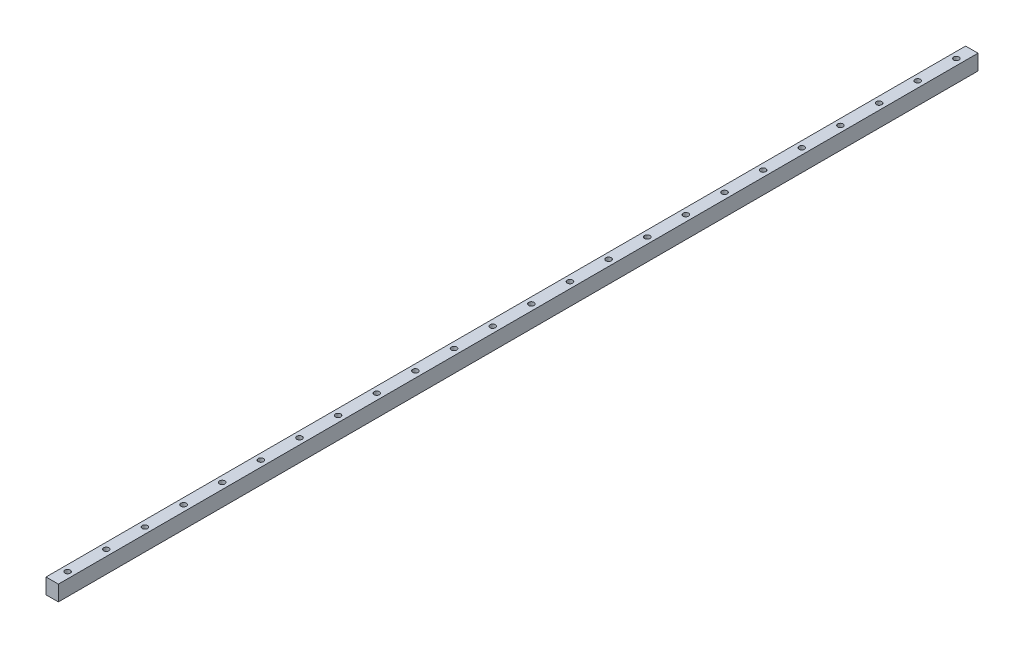
ISO-10303-21;
HEADER;
FILE_DESCRIPTION(('STEP AP214'),'2;1');
FILE_NAME('part.step','',(''),(''),'','','');
FILE_SCHEMA(('AUTOMOTIVE_DESIGN { 1 0 10303 214 1 1 1 1 }'));
ENDSEC;
DATA;
#1=APPLICATION_CONTEXT('core data for automotive mechanical design processes');
#2=APPLICATION_PROTOCOL_DEFINITION('international standard','automotive_design',2000,#1);
#3=PRODUCT_CONTEXT('',#1,'mechanical');
#4=PRODUCT('Part','Part','',(#3));
#5=PRODUCT_RELATED_PRODUCT_CATEGORY('part','',(#4));
#6=PRODUCT_DEFINITION_FORMATION('','',#4);
#7=PRODUCT_DEFINITION_CONTEXT('part definition',#1,'design');
#8=PRODUCT_DEFINITION('design','',#6,#7);
#9=PRODUCT_DEFINITION_SHAPE('','',#8);
#10=(LENGTH_UNIT() NAMED_UNIT(*) SI_UNIT(.MILLI.,.METRE.));
#11=(NAMED_UNIT(*) PLANE_ANGLE_UNIT() SI_UNIT($,.RADIAN.));
#12=(NAMED_UNIT(*) SI_UNIT($,.STERADIAN.) SOLID_ANGLE_UNIT());
#13=UNCERTAINTY_MEASURE_WITH_UNIT(LENGTH_MEASURE(1.E-05),#10,'distance_accuracy_value','');
#14=(GEOMETRIC_REPRESENTATION_CONTEXT(3) GLOBAL_UNCERTAINTY_ASSIGNED_CONTEXT((#13)) GLOBAL_UNIT_ASSIGNED_CONTEXT((#10,
#11,#12)) REPRESENTATION_CONTEXT('',''));
#15=CARTESIAN_POINT('',(0.,0.,0.));
#16=DIRECTION('',(0.,0.,1.));
#17=DIRECTION('',(1.,0.,0.));
#18=AXIS2_PLACEMENT_3D('',#15,#16,#17);
#19=CARTESIAN_POINT('',(0.,-5.,585.));
#20=DIRECTION('',(0.,1.,0.));
#21=DIRECTION('',(0.,0.,1.));
#22=AXIS2_PLACEMENT_3D('',#19,#20,#21);
#23=CYLINDRICAL_SURFACE('',#22,1.75);
#24=CARTESIAN_POINT('',(0.,-5.,585.));
#25=DIRECTION('',(0.,1.,0.));
#26=DIRECTION('',(0.,0.,1.));
#27=AXIS2_PLACEMENT_3D('',#24,#25,#26);
#28=CIRCLE('',#27,1.75);
#29=CARTESIAN_POINT('',(0.,-5.,586.75));
#30=VERTEX_POINT('',#29);
#31=EDGE_CURVE('E48',#30,#30,#28,.T.);
#32=ORIENTED_EDGE('',*,*,#31,.F.);
#33=EDGE_LOOP('',(#32));
#34=FACE_BOUND('',#33,.T.);
#35=CARTESIAN_POINT('',(0.,5.,585.));
#36=DIRECTION('',(0.,1.,0.));
#37=DIRECTION('',(0.,0.,1.));
#38=AXIS2_PLACEMENT_3D('',#35,#36,#37);
#39=CIRCLE('',#38,1.75);
#40=CARTESIAN_POINT('',(0.,5.,586.75));
#41=VERTEX_POINT('',#40);
#42=EDGE_CURVE('E11',#41,#41,#39,.T.);
#43=ORIENTED_EDGE('',*,*,#42,.T.);
#44=EDGE_LOOP('',(#43));
#45=FACE_BOUND('',#44,.T.);
#46=ADVANCED_FACE('F39',(#34,#45),#23,.F.);
#47=CARTESIAN_POINT('',(0.,-5.,560.));
#48=DIRECTION('',(0.,1.,0.));
#49=DIRECTION('',(0.,0.,1.));
#50=AXIS2_PLACEMENT_3D('',#47,#48,#49);
#51=CYLINDRICAL_SURFACE('',#50,1.75);
#52=CARTESIAN_POINT('',(0.,-5.,560.));
#53=DIRECTION('',(0.,1.,0.));
#54=DIRECTION('',(0.,0.,1.));
#55=AXIS2_PLACEMENT_3D('',#52,#53,#54);
#56=CIRCLE('',#55,1.75);
#57=CARTESIAN_POINT('',(0.,-5.,561.75));
#58=VERTEX_POINT('',#57);
#59=EDGE_CURVE('E289',#58,#58,#56,.T.);
#60=ORIENTED_EDGE('',*,*,#59,.F.);
#61=EDGE_LOOP('',(#60));
#62=FACE_BOUND('',#61,.T.);
#63=CARTESIAN_POINT('',(0.,5.,560.));
#64=DIRECTION('',(0.,1.,0.));
#65=DIRECTION('',(0.,0.,1.));
#66=AXIS2_PLACEMENT_3D('',#63,#64,#65);
#67=CIRCLE('',#66,1.75);
#68=CARTESIAN_POINT('',(0.,5.,561.75));
#69=VERTEX_POINT('',#68);
#70=EDGE_CURVE('E293',#69,#69,#67,.T.);
#71=ORIENTED_EDGE('',*,*,#70,.T.);
#72=EDGE_LOOP('',(#71));
#73=FACE_BOUND('',#72,.T.);
#74=ADVANCED_FACE('F304',(#62,#73),#51,.F.);
#75=CARTESIAN_POINT('',(0.,-5.,535.));
#76=DIRECTION('',(0.,1.,0.));
#77=DIRECTION('',(0.,0.,1.));
#78=AXIS2_PLACEMENT_3D('',#75,#76,#77);
#79=CYLINDRICAL_SURFACE('',#78,1.75);
#80=CARTESIAN_POINT('',(0.,-5.,535.));
#81=DIRECTION('',(0.,1.,0.));
#82=DIRECTION('',(0.,0.,1.));
#83=AXIS2_PLACEMENT_3D('',#80,#81,#82);
#84=CIRCLE('',#83,1.75);
#85=CARTESIAN_POINT('',(0.,-5.,536.75));
#86=VERTEX_POINT('',#85);
#87=EDGE_CURVE('E281',#86,#86,#84,.T.);
#88=ORIENTED_EDGE('',*,*,#87,.F.);
#89=EDGE_LOOP('',(#88));
#90=FACE_BOUND('',#89,.T.);
#91=CARTESIAN_POINT('',(0.,5.,535.));
#92=DIRECTION('',(0.,1.,0.));
#93=DIRECTION('',(0.,0.,1.));
#94=AXIS2_PLACEMENT_3D('',#91,#92,#93);
#95=CIRCLE('',#94,1.75);
#96=CARTESIAN_POINT('',(0.,5.,536.75));
#97=VERTEX_POINT('',#96);
#98=EDGE_CURVE('E285',#97,#97,#95,.T.);
#99=ORIENTED_EDGE('',*,*,#98,.T.);
#100=EDGE_LOOP('',(#99));
#101=FACE_BOUND('',#100,.T.);
#102=ADVANCED_FACE('F397',(#90,#101),#79,.F.);
#103=CARTESIAN_POINT('',(0.,-5.,510.));
#104=DIRECTION('',(0.,1.,0.));
#105=DIRECTION('',(0.,0.,1.));
#106=AXIS2_PLACEMENT_3D('',#103,#104,#105);
#107=CYLINDRICAL_SURFACE('',#106,1.75);
#108=CARTESIAN_POINT('',(0.,-5.,510.));
#109=DIRECTION('',(0.,1.,0.));
#110=DIRECTION('',(0.,0.,1.));
#111=AXIS2_PLACEMENT_3D('',#108,#109,#110);
#112=CIRCLE('',#111,1.75);
#113=CARTESIAN_POINT('',(0.,-5.,511.75));
#114=VERTEX_POINT('',#113);
#115=EDGE_CURVE('E273',#114,#114,#112,.T.);
#116=ORIENTED_EDGE('',*,*,#115,.F.);
#117=EDGE_LOOP('',(#116));
#118=FACE_BOUND('',#117,.T.);
#119=CARTESIAN_POINT('',(0.,5.,510.));
#120=DIRECTION('',(0.,1.,0.));
#121=DIRECTION('',(0.,0.,1.));
#122=AXIS2_PLACEMENT_3D('',#119,#120,#121);
#123=CIRCLE('',#122,1.75);
#124=CARTESIAN_POINT('',(0.,5.,511.75));
#125=VERTEX_POINT('',#124);
#126=EDGE_CURVE('E277',#125,#125,#123,.T.);
#127=ORIENTED_EDGE('',*,*,#126,.T.);
#128=EDGE_LOOP('',(#127));
#129=FACE_BOUND('',#128,.T.);
#130=ADVANCED_FACE('F393',(#118,#129),#107,.F.);
#131=CARTESIAN_POINT('',(0.,-5.,485.));
#132=DIRECTION('',(0.,1.,0.));
#133=DIRECTION('',(0.,0.,1.));
#134=AXIS2_PLACEMENT_3D('',#131,#132,#133);
#135=CYLINDRICAL_SURFACE('',#134,1.75);
#136=CARTESIAN_POINT('',(0.,-5.,485.));
#137=DIRECTION('',(0.,1.,0.));
#138=DIRECTION('',(0.,0.,1.));
#139=AXIS2_PLACEMENT_3D('',#136,#137,#138);
#140=CIRCLE('',#139,1.75);
#141=CARTESIAN_POINT('',(0.,-5.,486.75));
#142=VERTEX_POINT('',#141);
#143=EDGE_CURVE('E265',#142,#142,#140,.T.);
#144=ORIENTED_EDGE('',*,*,#143,.F.);
#145=EDGE_LOOP('',(#144));
#146=FACE_BOUND('',#145,.T.);
#147=CARTESIAN_POINT('',(0.,5.,485.));
#148=DIRECTION('',(0.,1.,0.));
#149=DIRECTION('',(0.,0.,1.));
#150=AXIS2_PLACEMENT_3D('',#147,#148,#149);
#151=CIRCLE('',#150,1.75);
#152=CARTESIAN_POINT('',(0.,5.,486.75));
#153=VERTEX_POINT('',#152);
#154=EDGE_CURVE('E269',#153,#153,#151,.T.);
#155=ORIENTED_EDGE('',*,*,#154,.T.);
#156=EDGE_LOOP('',(#155));
#157=FACE_BOUND('',#156,.T.);
#158=ADVANCED_FACE('F389',(#146,#157),#135,.F.);
#159=CARTESIAN_POINT('',(0.,-5.,460.));
#160=DIRECTION('',(0.,1.,0.));
#161=DIRECTION('',(0.,0.,1.));
#162=AXIS2_PLACEMENT_3D('',#159,#160,#161);
#163=CYLINDRICAL_SURFACE('',#162,1.75);
#164=CARTESIAN_POINT('',(0.,-5.,460.));
#165=DIRECTION('',(0.,1.,0.));
#166=DIRECTION('',(0.,0.,1.));
#167=AXIS2_PLACEMENT_3D('',#164,#165,#166);
#168=CIRCLE('',#167,1.75);
#169=CARTESIAN_POINT('',(0.,-5.,461.75));
#170=VERTEX_POINT('',#169);
#171=EDGE_CURVE('E257',#170,#170,#168,.T.);
#172=ORIENTED_EDGE('',*,*,#171,.F.);
#173=EDGE_LOOP('',(#172));
#174=FACE_BOUND('',#173,.T.);
#175=CARTESIAN_POINT('',(0.,5.,460.));
#176=DIRECTION('',(0.,1.,0.));
#177=DIRECTION('',(0.,0.,1.));
#178=AXIS2_PLACEMENT_3D('',#175,#176,#177);
#179=CIRCLE('',#178,1.75);
#180=CARTESIAN_POINT('',(0.,5.,461.75));
#181=VERTEX_POINT('',#180);
#182=EDGE_CURVE('E261',#181,#181,#179,.T.);
#183=ORIENTED_EDGE('',*,*,#182,.T.);
#184=EDGE_LOOP('',(#183));
#185=FACE_BOUND('',#184,.T.);
#186=ADVANCED_FACE('F385',(#174,#185),#163,.F.);
#187=CARTESIAN_POINT('',(0.,-5.,435.));
#188=DIRECTION('',(0.,1.,0.));
#189=DIRECTION('',(0.,0.,1.));
#190=AXIS2_PLACEMENT_3D('',#187,#188,#189);
#191=CYLINDRICAL_SURFACE('',#190,1.75);
#192=CARTESIAN_POINT('',(0.,-5.,435.));
#193=DIRECTION('',(0.,1.,0.));
#194=DIRECTION('',(0.,0.,1.));
#195=AXIS2_PLACEMENT_3D('',#192,#193,#194);
#196=CIRCLE('',#195,1.75);
#197=CARTESIAN_POINT('',(0.,-5.,436.75));
#198=VERTEX_POINT('',#197);
#199=EDGE_CURVE('E249',#198,#198,#196,.T.);
#200=ORIENTED_EDGE('',*,*,#199,.F.);
#201=EDGE_LOOP('',(#200));
#202=FACE_BOUND('',#201,.T.);
#203=CARTESIAN_POINT('',(0.,5.,435.));
#204=DIRECTION('',(0.,1.,0.));
#205=DIRECTION('',(0.,0.,1.));
#206=AXIS2_PLACEMENT_3D('',#203,#204,#205);
#207=CIRCLE('',#206,1.75);
#208=CARTESIAN_POINT('',(0.,5.,436.75));
#209=VERTEX_POINT('',#208);
#210=EDGE_CURVE('E253',#209,#209,#207,.T.);
#211=ORIENTED_EDGE('',*,*,#210,.T.);
#212=EDGE_LOOP('',(#211));
#213=FACE_BOUND('',#212,.T.);
#214=ADVANCED_FACE('F381',(#202,#213),#191,.F.);
#215=CARTESIAN_POINT('',(0.,-5.,410.));
#216=DIRECTION('',(0.,1.,0.));
#217=DIRECTION('',(0.,0.,1.));
#218=AXIS2_PLACEMENT_3D('',#215,#216,#217);
#219=CYLINDRICAL_SURFACE('',#218,1.75);
#220=CARTESIAN_POINT('',(0.,-5.,410.));
#221=DIRECTION('',(0.,1.,0.));
#222=DIRECTION('',(0.,0.,1.));
#223=AXIS2_PLACEMENT_3D('',#220,#221,#222);
#224=CIRCLE('',#223,1.75);
#225=CARTESIAN_POINT('',(0.,-5.,411.75));
#226=VERTEX_POINT('',#225);
#227=EDGE_CURVE('E241',#226,#226,#224,.T.);
#228=ORIENTED_EDGE('',*,*,#227,.F.);
#229=EDGE_LOOP('',(#228));
#230=FACE_BOUND('',#229,.T.);
#231=CARTESIAN_POINT('',(0.,5.,410.));
#232=DIRECTION('',(0.,1.,0.));
#233=DIRECTION('',(0.,0.,1.));
#234=AXIS2_PLACEMENT_3D('',#231,#232,#233);
#235=CIRCLE('',#234,1.75);
#236=CARTESIAN_POINT('',(0.,5.,411.75));
#237=VERTEX_POINT('',#236);
#238=EDGE_CURVE('E245',#237,#237,#235,.T.);
#239=ORIENTED_EDGE('',*,*,#238,.T.);
#240=EDGE_LOOP('',(#239));
#241=FACE_BOUND('',#240,.T.);
#242=ADVANCED_FACE('F377',(#230,#241),#219,.F.);
#243=CARTESIAN_POINT('',(0.,-5.,385.));
#244=DIRECTION('',(0.,1.,0.));
#245=DIRECTION('',(0.,0.,1.));
#246=AXIS2_PLACEMENT_3D('',#243,#244,#245);
#247=CYLINDRICAL_SURFACE('',#246,1.75);
#248=CARTESIAN_POINT('',(0.,-5.,385.));
#249=DIRECTION('',(0.,1.,0.));
#250=DIRECTION('',(0.,0.,1.));
#251=AXIS2_PLACEMENT_3D('',#248,#249,#250);
#252=CIRCLE('',#251,1.75);
#253=CARTESIAN_POINT('',(0.,-5.,386.75));
#254=VERTEX_POINT('',#253);
#255=EDGE_CURVE('E233',#254,#254,#252,.T.);
#256=ORIENTED_EDGE('',*,*,#255,.F.);
#257=EDGE_LOOP('',(#256));
#258=FACE_BOUND('',#257,.T.);
#259=CARTESIAN_POINT('',(0.,5.,385.));
#260=DIRECTION('',(0.,1.,0.));
#261=DIRECTION('',(0.,0.,1.));
#262=AXIS2_PLACEMENT_3D('',#259,#260,#261);
#263=CIRCLE('',#262,1.75);
#264=CARTESIAN_POINT('',(0.,5.,386.75));
#265=VERTEX_POINT('',#264);
#266=EDGE_CURVE('E237',#265,#265,#263,.T.);
#267=ORIENTED_EDGE('',*,*,#266,.T.);
#268=EDGE_LOOP('',(#267));
#269=FACE_BOUND('',#268,.T.);
#270=ADVANCED_FACE('F373',(#258,#269),#247,.F.);
#271=CARTESIAN_POINT('',(0.,-5.,360.));
#272=DIRECTION('',(0.,1.,0.));
#273=DIRECTION('',(0.,0.,1.));
#274=AXIS2_PLACEMENT_3D('',#271,#272,#273);
#275=CYLINDRICAL_SURFACE('',#274,1.75);
#276=CARTESIAN_POINT('',(0.,-5.,360.));
#277=DIRECTION('',(0.,1.,0.));
#278=DIRECTION('',(0.,0.,1.));
#279=AXIS2_PLACEMENT_3D('',#276,#277,#278);
#280=CIRCLE('',#279,1.75);
#281=CARTESIAN_POINT('',(0.,-5.,361.75));
#282=VERTEX_POINT('',#281);
#283=EDGE_CURVE('E225',#282,#282,#280,.T.);
#284=ORIENTED_EDGE('',*,*,#283,.F.);
#285=EDGE_LOOP('',(#284));
#286=FACE_BOUND('',#285,.T.);
#287=CARTESIAN_POINT('',(0.,5.,360.));
#288=DIRECTION('',(0.,1.,0.));
#289=DIRECTION('',(0.,0.,1.));
#290=AXIS2_PLACEMENT_3D('',#287,#288,#289);
#291=CIRCLE('',#290,1.75);
#292=CARTESIAN_POINT('',(0.,5.,361.75));
#293=VERTEX_POINT('',#292);
#294=EDGE_CURVE('E229',#293,#293,#291,.T.);
#295=ORIENTED_EDGE('',*,*,#294,.T.);
#296=EDGE_LOOP('',(#295));
#297=FACE_BOUND('',#296,.T.);
#298=ADVANCED_FACE('F369',(#286,#297),#275,.F.);
#299=CARTESIAN_POINT('',(0.,-5.,335.));
#300=DIRECTION('',(0.,1.,0.));
#301=DIRECTION('',(0.,0.,1.));
#302=AXIS2_PLACEMENT_3D('',#299,#300,#301);
#303=CYLINDRICAL_SURFACE('',#302,1.75);
#304=CARTESIAN_POINT('',(0.,-5.,335.));
#305=DIRECTION('',(0.,1.,0.));
#306=DIRECTION('',(0.,0.,1.));
#307=AXIS2_PLACEMENT_3D('',#304,#305,#306);
#308=CIRCLE('',#307,1.75);
#309=CARTESIAN_POINT('',(0.,-5.,336.75));
#310=VERTEX_POINT('',#309);
#311=EDGE_CURVE('E217',#310,#310,#308,.T.);
#312=ORIENTED_EDGE('',*,*,#311,.F.);
#313=EDGE_LOOP('',(#312));
#314=FACE_BOUND('',#313,.T.);
#315=CARTESIAN_POINT('',(0.,5.,335.));
#316=DIRECTION('',(0.,1.,0.));
#317=DIRECTION('',(0.,0.,1.));
#318=AXIS2_PLACEMENT_3D('',#315,#316,#317);
#319=CIRCLE('',#318,1.75);
#320=CARTESIAN_POINT('',(0.,5.,336.75));
#321=VERTEX_POINT('',#320);
#322=EDGE_CURVE('E221',#321,#321,#319,.T.);
#323=ORIENTED_EDGE('',*,*,#322,.T.);
#324=EDGE_LOOP('',(#323));
#325=FACE_BOUND('',#324,.T.);
#326=ADVANCED_FACE('F365',(#314,#325),#303,.F.);
#327=CARTESIAN_POINT('',(0.,-5.,310.));
#328=DIRECTION('',(0.,1.,0.));
#329=DIRECTION('',(0.,0.,1.));
#330=AXIS2_PLACEMENT_3D('',#327,#328,#329);
#331=CYLINDRICAL_SURFACE('',#330,1.75);
#332=CARTESIAN_POINT('',(0.,-5.,310.));
#333=DIRECTION('',(0.,1.,0.));
#334=DIRECTION('',(0.,0.,1.));
#335=AXIS2_PLACEMENT_3D('',#332,#333,#334);
#336=CIRCLE('',#335,1.75);
#337=CARTESIAN_POINT('',(0.,-5.,311.75));
#338=VERTEX_POINT('',#337);
#339=EDGE_CURVE('E209',#338,#338,#336,.T.);
#340=ORIENTED_EDGE('',*,*,#339,.F.);
#341=EDGE_LOOP('',(#340));
#342=FACE_BOUND('',#341,.T.);
#343=CARTESIAN_POINT('',(0.,5.,310.));
#344=DIRECTION('',(0.,1.,0.));
#345=DIRECTION('',(0.,0.,1.));
#346=AXIS2_PLACEMENT_3D('',#343,#344,#345);
#347=CIRCLE('',#346,1.75);
#348=CARTESIAN_POINT('',(0.,5.,311.75));
#349=VERTEX_POINT('',#348);
#350=EDGE_CURVE('E213',#349,#349,#347,.T.);
#351=ORIENTED_EDGE('',*,*,#350,.T.);
#352=EDGE_LOOP('',(#351));
#353=FACE_BOUND('',#352,.T.);
#354=ADVANCED_FACE('F361',(#342,#353),#331,.F.);
#355=CARTESIAN_POINT('',(0.,-5.,285.));
#356=DIRECTION('',(0.,1.,0.));
#357=DIRECTION('',(0.,0.,1.));
#358=AXIS2_PLACEMENT_3D('',#355,#356,#357);
#359=CYLINDRICAL_SURFACE('',#358,1.75);
#360=CARTESIAN_POINT('',(0.,-5.,285.));
#361=DIRECTION('',(0.,1.,0.));
#362=DIRECTION('',(0.,0.,1.));
#363=AXIS2_PLACEMENT_3D('',#360,#361,#362);
#364=CIRCLE('',#363,1.75);
#365=CARTESIAN_POINT('',(0.,-5.,286.75));
#366=VERTEX_POINT('',#365);
#367=EDGE_CURVE('E201',#366,#366,#364,.T.);
#368=ORIENTED_EDGE('',*,*,#367,.F.);
#369=EDGE_LOOP('',(#368));
#370=FACE_BOUND('',#369,.T.);
#371=CARTESIAN_POINT('',(0.,5.,285.));
#372=DIRECTION('',(0.,1.,0.));
#373=DIRECTION('',(0.,0.,1.));
#374=AXIS2_PLACEMENT_3D('',#371,#372,#373);
#375=CIRCLE('',#374,1.75);
#376=CARTESIAN_POINT('',(0.,5.,286.75));
#377=VERTEX_POINT('',#376);
#378=EDGE_CURVE('E205',#377,#377,#375,.T.);
#379=ORIENTED_EDGE('',*,*,#378,.T.);
#380=EDGE_LOOP('',(#379));
#381=FACE_BOUND('',#380,.T.);
#382=ADVANCED_FACE('F357',(#370,#381),#359,.F.);
#383=CARTESIAN_POINT('',(0.,-5.,260.));
#384=DIRECTION('',(0.,1.,0.));
#385=DIRECTION('',(0.,0.,1.));
#386=AXIS2_PLACEMENT_3D('',#383,#384,#385);
#387=CYLINDRICAL_SURFACE('',#386,1.75);
#388=CARTESIAN_POINT('',(0.,-5.,260.));
#389=DIRECTION('',(0.,1.,0.));
#390=DIRECTION('',(0.,0.,1.));
#391=AXIS2_PLACEMENT_3D('',#388,#389,#390);
#392=CIRCLE('',#391,1.75);
#393=CARTESIAN_POINT('',(0.,-5.,261.75));
#394=VERTEX_POINT('',#393);
#395=EDGE_CURVE('E193',#394,#394,#392,.T.);
#396=ORIENTED_EDGE('',*,*,#395,.F.);
#397=EDGE_LOOP('',(#396));
#398=FACE_BOUND('',#397,.T.);
#399=CARTESIAN_POINT('',(0.,5.,260.));
#400=DIRECTION('',(0.,1.,0.));
#401=DIRECTION('',(0.,0.,1.));
#402=AXIS2_PLACEMENT_3D('',#399,#400,#401);
#403=CIRCLE('',#402,1.75);
#404=CARTESIAN_POINT('',(0.,5.,261.75));
#405=VERTEX_POINT('',#404);
#406=EDGE_CURVE('E197',#405,#405,#403,.T.);
#407=ORIENTED_EDGE('',*,*,#406,.T.);
#408=EDGE_LOOP('',(#407));
#409=FACE_BOUND('',#408,.T.);
#410=ADVANCED_FACE('F353',(#398,#409),#387,.F.);
#411=CARTESIAN_POINT('',(0.,-5.,235.));
#412=DIRECTION('',(0.,1.,0.));
#413=DIRECTION('',(0.,0.,1.));
#414=AXIS2_PLACEMENT_3D('',#411,#412,#413);
#415=CYLINDRICAL_SURFACE('',#414,1.75);
#416=CARTESIAN_POINT('',(0.,-5.,235.));
#417=DIRECTION('',(0.,1.,0.));
#418=DIRECTION('',(0.,0.,1.));
#419=AXIS2_PLACEMENT_3D('',#416,#417,#418);
#420=CIRCLE('',#419,1.75);
#421=CARTESIAN_POINT('',(0.,-5.,236.75));
#422=VERTEX_POINT('',#421);
#423=EDGE_CURVE('E185',#422,#422,#420,.T.);
#424=ORIENTED_EDGE('',*,*,#423,.F.);
#425=EDGE_LOOP('',(#424));
#426=FACE_BOUND('',#425,.T.);
#427=CARTESIAN_POINT('',(0.,5.,235.));
#428=DIRECTION('',(0.,1.,0.));
#429=DIRECTION('',(0.,0.,1.));
#430=AXIS2_PLACEMENT_3D('',#427,#428,#429);
#431=CIRCLE('',#430,1.75);
#432=CARTESIAN_POINT('',(0.,5.,236.75));
#433=VERTEX_POINT('',#432);
#434=EDGE_CURVE('E189',#433,#433,#431,.T.);
#435=ORIENTED_EDGE('',*,*,#434,.T.);
#436=EDGE_LOOP('',(#435));
#437=FACE_BOUND('',#436,.T.);
#438=ADVANCED_FACE('F349',(#426,#437),#415,.F.);
#439=CARTESIAN_POINT('',(0.,-5.,210.));
#440=DIRECTION('',(0.,1.,0.));
#441=DIRECTION('',(0.,0.,1.));
#442=AXIS2_PLACEMENT_3D('',#439,#440,#441);
#443=CYLINDRICAL_SURFACE('',#442,1.75);
#444=CARTESIAN_POINT('',(0.,-5.,210.));
#445=DIRECTION('',(0.,1.,0.));
#446=DIRECTION('',(0.,0.,1.));
#447=AXIS2_PLACEMENT_3D('',#444,#445,#446);
#448=CIRCLE('',#447,1.75);
#449=CARTESIAN_POINT('',(0.,-5.,211.75));
#450=VERTEX_POINT('',#449);
#451=EDGE_CURVE('E177',#450,#450,#448,.T.);
#452=ORIENTED_EDGE('',*,*,#451,.F.);
#453=EDGE_LOOP('',(#452));
#454=FACE_BOUND('',#453,.T.);
#455=CARTESIAN_POINT('',(0.,5.,210.));
#456=DIRECTION('',(0.,1.,0.));
#457=DIRECTION('',(0.,0.,1.));
#458=AXIS2_PLACEMENT_3D('',#455,#456,#457);
#459=CIRCLE('',#458,1.75);
#460=CARTESIAN_POINT('',(0.,5.,211.75));
#461=VERTEX_POINT('',#460);
#462=EDGE_CURVE('E181',#461,#461,#459,.T.);
#463=ORIENTED_EDGE('',*,*,#462,.T.);
#464=EDGE_LOOP('',(#463));
#465=FACE_BOUND('',#464,.T.);
#466=ADVANCED_FACE('F345',(#454,#465),#443,.F.);
#467=CARTESIAN_POINT('',(0.,-5.,185.));
#468=DIRECTION('',(0.,1.,0.));
#469=DIRECTION('',(0.,0.,1.));
#470=AXIS2_PLACEMENT_3D('',#467,#468,#469);
#471=CYLINDRICAL_SURFACE('',#470,1.75);
#472=CARTESIAN_POINT('',(0.,-5.,185.));
#473=DIRECTION('',(0.,1.,0.));
#474=DIRECTION('',(0.,0.,1.));
#475=AXIS2_PLACEMENT_3D('',#472,#473,#474);
#476=CIRCLE('',#475,1.75);
#477=CARTESIAN_POINT('',(0.,-5.,186.75));
#478=VERTEX_POINT('',#477);
#479=EDGE_CURVE('E169',#478,#478,#476,.T.);
#480=ORIENTED_EDGE('',*,*,#479,.F.);
#481=EDGE_LOOP('',(#480));
#482=FACE_BOUND('',#481,.T.);
#483=CARTESIAN_POINT('',(0.,5.,185.));
#484=DIRECTION('',(0.,1.,0.));
#485=DIRECTION('',(0.,0.,1.));
#486=AXIS2_PLACEMENT_3D('',#483,#484,#485);
#487=CIRCLE('',#486,1.75);
#488=CARTESIAN_POINT('',(0.,5.,186.75));
#489=VERTEX_POINT('',#488);
#490=EDGE_CURVE('E173',#489,#489,#487,.T.);
#491=ORIENTED_EDGE('',*,*,#490,.T.);
#492=EDGE_LOOP('',(#491));
#493=FACE_BOUND('',#492,.T.);
#494=ADVANCED_FACE('F341',(#482,#493),#471,.F.);
#495=CARTESIAN_POINT('',(0.,-5.,160.));
#496=DIRECTION('',(0.,1.,0.));
#497=DIRECTION('',(0.,0.,1.));
#498=AXIS2_PLACEMENT_3D('',#495,#496,#497);
#499=CYLINDRICAL_SURFACE('',#498,1.75);
#500=CARTESIAN_POINT('',(0.,-5.,160.));
#501=DIRECTION('',(0.,1.,0.));
#502=DIRECTION('',(0.,0.,1.));
#503=AXIS2_PLACEMENT_3D('',#500,#501,#502);
#504=CIRCLE('',#503,1.75);
#505=CARTESIAN_POINT('',(0.,-5.,161.75));
#506=VERTEX_POINT('',#505);
#507=EDGE_CURVE('E161',#506,#506,#504,.T.);
#508=ORIENTED_EDGE('',*,*,#507,.F.);
#509=EDGE_LOOP('',(#508));
#510=FACE_BOUND('',#509,.T.);
#511=CARTESIAN_POINT('',(0.,5.,160.));
#512=DIRECTION('',(0.,1.,0.));
#513=DIRECTION('',(0.,0.,1.));
#514=AXIS2_PLACEMENT_3D('',#511,#512,#513);
#515=CIRCLE('',#514,1.75);
#516=CARTESIAN_POINT('',(0.,5.,161.75));
#517=VERTEX_POINT('',#516);
#518=EDGE_CURVE('E165',#517,#517,#515,.T.);
#519=ORIENTED_EDGE('',*,*,#518,.T.);
#520=EDGE_LOOP('',(#519));
#521=FACE_BOUND('',#520,.T.);
#522=ADVANCED_FACE('F337',(#510,#521),#499,.F.);
#523=CARTESIAN_POINT('',(0.,-5.,135.));
#524=DIRECTION('',(0.,1.,0.));
#525=DIRECTION('',(0.,0.,1.));
#526=AXIS2_PLACEMENT_3D('',#523,#524,#525);
#527=CYLINDRICAL_SURFACE('',#526,1.75);
#528=CARTESIAN_POINT('',(0.,-5.,135.));
#529=DIRECTION('',(0.,1.,0.));
#530=DIRECTION('',(0.,0.,1.));
#531=AXIS2_PLACEMENT_3D('',#528,#529,#530);
#532=CIRCLE('',#531,1.75);
#533=CARTESIAN_POINT('',(0.,-5.,136.75));
#534=VERTEX_POINT('',#533);
#535=EDGE_CURVE('E153',#534,#534,#532,.T.);
#536=ORIENTED_EDGE('',*,*,#535,.F.);
#537=EDGE_LOOP('',(#536));
#538=FACE_BOUND('',#537,.T.);
#539=CARTESIAN_POINT('',(0.,5.,135.));
#540=DIRECTION('',(0.,1.,0.));
#541=DIRECTION('',(0.,0.,1.));
#542=AXIS2_PLACEMENT_3D('',#539,#540,#541);
#543=CIRCLE('',#542,1.75);
#544=CARTESIAN_POINT('',(0.,5.,136.75));
#545=VERTEX_POINT('',#544);
#546=EDGE_CURVE('E157',#545,#545,#543,.T.);
#547=ORIENTED_EDGE('',*,*,#546,.T.);
#548=EDGE_LOOP('',(#547));
#549=FACE_BOUND('',#548,.T.);
#550=ADVANCED_FACE('F333',(#538,#549),#527,.F.);
#551=CARTESIAN_POINT('',(0.,-5.,110.));
#552=DIRECTION('',(0.,1.,0.));
#553=DIRECTION('',(0.,0.,1.));
#554=AXIS2_PLACEMENT_3D('',#551,#552,#553);
#555=CYLINDRICAL_SURFACE('',#554,1.75);
#556=CARTESIAN_POINT('',(0.,-5.,110.));
#557=DIRECTION('',(0.,1.,0.));
#558=DIRECTION('',(0.,0.,1.));
#559=AXIS2_PLACEMENT_3D('',#556,#557,#558);
#560=CIRCLE('',#559,1.75);
#561=CARTESIAN_POINT('',(0.,-5.,111.75));
#562=VERTEX_POINT('',#561);
#563=EDGE_CURVE('E145',#562,#562,#560,.T.);
#564=ORIENTED_EDGE('',*,*,#563,.F.);
#565=EDGE_LOOP('',(#564));
#566=FACE_BOUND('',#565,.T.);
#567=CARTESIAN_POINT('',(0.,5.,110.));
#568=DIRECTION('',(0.,1.,0.));
#569=DIRECTION('',(0.,0.,1.));
#570=AXIS2_PLACEMENT_3D('',#567,#568,#569);
#571=CIRCLE('',#570,1.75);
#572=CARTESIAN_POINT('',(0.,5.,111.75));
#573=VERTEX_POINT('',#572);
#574=EDGE_CURVE('E149',#573,#573,#571,.T.);
#575=ORIENTED_EDGE('',*,*,#574,.T.);
#576=EDGE_LOOP('',(#575));
#577=FACE_BOUND('',#576,.T.);
#578=ADVANCED_FACE('F329',(#566,#577),#555,.F.);
#579=CARTESIAN_POINT('',(0.,-5.,85.));
#580=DIRECTION('',(0.,1.,0.));
#581=DIRECTION('',(0.,0.,1.));
#582=AXIS2_PLACEMENT_3D('',#579,#580,#581);
#583=CYLINDRICAL_SURFACE('',#582,1.75);
#584=CARTESIAN_POINT('',(0.,-5.,85.));
#585=DIRECTION('',(0.,1.,0.));
#586=DIRECTION('',(0.,0.,1.));
#587=AXIS2_PLACEMENT_3D('',#584,#585,#586);
#588=CIRCLE('',#587,1.75);
#589=CARTESIAN_POINT('',(0.,-5.,86.75));
#590=VERTEX_POINT('',#589);
#591=EDGE_CURVE('E137',#590,#590,#588,.T.);
#592=ORIENTED_EDGE('',*,*,#591,.F.);
#593=EDGE_LOOP('',(#592));
#594=FACE_BOUND('',#593,.T.);
#595=CARTESIAN_POINT('',(0.,5.,85.));
#596=DIRECTION('',(0.,1.,0.));
#597=DIRECTION('',(0.,0.,1.));
#598=AXIS2_PLACEMENT_3D('',#595,#596,#597);
#599=CIRCLE('',#598,1.75);
#600=CARTESIAN_POINT('',(0.,5.,86.75));
#601=VERTEX_POINT('',#600);
#602=EDGE_CURVE('E141',#601,#601,#599,.T.);
#603=ORIENTED_EDGE('',*,*,#602,.T.);
#604=EDGE_LOOP('',(#603));
#605=FACE_BOUND('',#604,.T.);
#606=ADVANCED_FACE('F325',(#594,#605),#583,.F.);
#607=CARTESIAN_POINT('',(0.,-5.,60.));
#608=DIRECTION('',(0.,1.,0.));
#609=DIRECTION('',(0.,0.,1.));
#610=AXIS2_PLACEMENT_3D('',#607,#608,#609);
#611=CYLINDRICAL_SURFACE('',#610,1.75);
#612=CARTESIAN_POINT('',(0.,-5.,60.));
#613=DIRECTION('',(0.,1.,0.));
#614=DIRECTION('',(0.,0.,1.));
#615=AXIS2_PLACEMENT_3D('',#612,#613,#614);
#616=CIRCLE('',#615,1.75);
#617=CARTESIAN_POINT('',(0.,-5.,61.75));
#618=VERTEX_POINT('',#617);
#619=EDGE_CURVE('E129',#618,#618,#616,.T.);
#620=ORIENTED_EDGE('',*,*,#619,.F.);
#621=EDGE_LOOP('',(#620));
#622=FACE_BOUND('',#621,.T.);
#623=CARTESIAN_POINT('',(0.,5.,60.));
#624=DIRECTION('',(0.,1.,0.));
#625=DIRECTION('',(0.,0.,1.));
#626=AXIS2_PLACEMENT_3D('',#623,#624,#625);
#627=CIRCLE('',#626,1.75);
#628=CARTESIAN_POINT('',(0.,5.,61.75));
#629=VERTEX_POINT('',#628);
#630=EDGE_CURVE('E133',#629,#629,#627,.T.);
#631=ORIENTED_EDGE('',*,*,#630,.T.);
#632=EDGE_LOOP('',(#631));
#633=FACE_BOUND('',#632,.T.);
#634=ADVANCED_FACE('F316',(#622,#633),#611,.F.);
#635=CARTESIAN_POINT('',(4.,-5.,595.));
#636=DIRECTION('',(-1.,0.,0.));
#637=DIRECTION('',(0.,0.,1.));
#638=AXIS2_PLACEMENT_3D('',#635,#636,#637);
#639=PLANE('',#638);
#640=DIRECTION('',(0.,1.,0.));
#641=VECTOR('',#640,1.);
#642=CARTESIAN_POINT('',(4.,-5.,0.));
#643=LINE('',#642,#641);
#644=CARTESIAN_POINT('',(4.,-5.,0.));
#645=VERTEX_POINT('',#644);
#646=CARTESIAN_POINT('',(4.,5.,0.));
#647=VERTEX_POINT('',#646);
#648=EDGE_CURVE('E112',#645,#647,#643,.T.);
#649=ORIENTED_EDGE('',*,*,#648,.T.);
#650=DIRECTION('',(0.,0.,-1.));
#651=VECTOR('',#650,1.);
#652=CARTESIAN_POINT('',(4.,5.,595.));
#653=LINE('',#652,#651);
#654=CARTESIAN_POINT('',(4.,5.,595.));
#655=VERTEX_POINT('',#654);
#656=EDGE_CURVE('E101',#655,#647,#653,.T.);
#657=ORIENTED_EDGE('',*,*,#656,.F.);
#658=DIRECTION('',(0.,1.,0.));
#659=VECTOR('',#658,1.);
#660=CARTESIAN_POINT('',(4.,-5.,595.));
#661=LINE('',#660,#659);
#662=CARTESIAN_POINT('',(4.,-5.,595.));
#663=VERTEX_POINT('',#662);
#664=EDGE_CURVE('E92',#663,#655,#661,.T.);
#665=ORIENTED_EDGE('',*,*,#664,.F.);
#666=DIRECTION('',(0.,0.,-1.));
#667=VECTOR('',#666,1.);
#668=CARTESIAN_POINT('',(4.,-5.,595.));
#669=LINE('',#668,#667);
#670=EDGE_CURVE('E108',#663,#645,#669,.T.);
#671=ORIENTED_EDGE('',*,*,#670,.T.);
#672=EDGE_LOOP('',(#649,#657,#665,#671));
#673=FACE_BOUND('',#672,.T.);
#674=ADVANCED_FACE('F308',(#673),#639,.F.);
#675=CARTESIAN_POINT('',(-4.,5.,595.));
#676=DIRECTION('',(0.,-1.,0.));
#677=DIRECTION('',(0.,0.,-1.));
#678=AXIS2_PLACEMENT_3D('',#675,#676,#677);
#679=PLANE('',#678);
#680=CARTESIAN_POINT('',(0.,5.,35.));
#681=DIRECTION('',(0.,1.,0.));
#682=DIRECTION('',(0.,0.,1.));
#683=AXIS2_PLACEMENT_3D('',#680,#681,#682);
#684=CIRCLE('',#683,1.75);
#685=CARTESIAN_POINT('',(0.,5.,36.75));
#686=VERTEX_POINT('',#685);
#687=EDGE_CURVE('E436',#686,#686,#684,.T.);
#688=ORIENTED_EDGE('',*,*,#687,.F.);
#689=EDGE_LOOP('',(#688));
#690=FACE_BOUND('',#689,.T.);
#691=CARTESIAN_POINT('',(0.,5.,10.));
#692=DIRECTION('',(0.,1.,0.));
#693=DIRECTION('',(0.,0.,1.));
#694=AXIS2_PLACEMENT_3D('',#691,#692,#693);
#695=CIRCLE('',#694,1.75);
#696=CARTESIAN_POINT('',(0.,5.,11.75));
#697=VERTEX_POINT('',#696);
#698=EDGE_CURVE('E438',#697,#697,#695,.T.);
#699=ORIENTED_EDGE('',*,*,#698,.F.);
#700=EDGE_LOOP('',(#699));
#701=FACE_BOUND('',#700,.T.);
#702=DIRECTION('',(-1.,0.,0.));
#703=VECTOR('',#702,1.);
#704=CARTESIAN_POINT('',(-4.,5.,0.));
#705=LINE('',#704,#703);
#706=CARTESIAN_POINT('',(-4.,5.,0.));
#707=VERTEX_POINT('',#706);
#708=EDGE_CURVE('E99',#647,#707,#705,.T.);
#709=ORIENTED_EDGE('',*,*,#708,.T.);
#710=DIRECTION('',(0.,0.,-1.));
#711=VECTOR('',#710,1.);
#712=CARTESIAN_POINT('',(-4.,5.,595.));
#713=LINE('',#712,#711);
#714=CARTESIAN_POINT('',(-4.,5.,595.));
#715=VERTEX_POINT('',#714);
#716=EDGE_CURVE('E96',#715,#707,#713,.T.);
#717=ORIENTED_EDGE('',*,*,#716,.F.);
#718=DIRECTION('',(-1.,0.,0.));
#719=VECTOR('',#718,1.);
#720=CARTESIAN_POINT('',(-4.,5.,595.));
#721=LINE('',#720,#719);
#722=EDGE_CURVE('E87',#655,#715,#721,.T.);
#723=ORIENTED_EDGE('',*,*,#722,.F.);
#724=ORIENTED_EDGE('',*,*,#656,.T.);
#725=EDGE_LOOP('',(#709,#717,#723,#724));
#726=FACE_BOUND('',#725,.T.);
#727=ORIENTED_EDGE('',*,*,#630,.F.);
#728=EDGE_LOOP('',(#727));
#729=FACE_BOUND('',#728,.T.);
#730=ORIENTED_EDGE('',*,*,#602,.F.);
#731=EDGE_LOOP('',(#730));
#732=FACE_BOUND('',#731,.T.);
#733=ORIENTED_EDGE('',*,*,#574,.F.);
#734=EDGE_LOOP('',(#733));
#735=FACE_BOUND('',#734,.T.);
#736=ORIENTED_EDGE('',*,*,#546,.F.);
#737=EDGE_LOOP('',(#736));
#738=FACE_BOUND('',#737,.T.);
#739=ORIENTED_EDGE('',*,*,#518,.F.);
#740=EDGE_LOOP('',(#739));
#741=FACE_BOUND('',#740,.T.);
#742=ORIENTED_EDGE('',*,*,#490,.F.);
#743=EDGE_LOOP('',(#742));
#744=FACE_BOUND('',#743,.T.);
#745=ORIENTED_EDGE('',*,*,#462,.F.);
#746=EDGE_LOOP('',(#745));
#747=FACE_BOUND('',#746,.T.);
#748=ORIENTED_EDGE('',*,*,#434,.F.);
#749=EDGE_LOOP('',(#748));
#750=FACE_BOUND('',#749,.T.);
#751=ORIENTED_EDGE('',*,*,#406,.F.);
#752=EDGE_LOOP('',(#751));
#753=FACE_BOUND('',#752,.T.);
#754=ORIENTED_EDGE('',*,*,#378,.F.);
#755=EDGE_LOOP('',(#754));
#756=FACE_BOUND('',#755,.T.);
#757=ORIENTED_EDGE('',*,*,#350,.F.);
#758=EDGE_LOOP('',(#757));
#759=FACE_BOUND('',#758,.T.);
#760=ORIENTED_EDGE('',*,*,#322,.F.);
#761=EDGE_LOOP('',(#760));
#762=FACE_BOUND('',#761,.T.);
#763=ORIENTED_EDGE('',*,*,#294,.F.);
#764=EDGE_LOOP('',(#763));
#765=FACE_BOUND('',#764,.T.);
#766=ORIENTED_EDGE('',*,*,#266,.F.);
#767=EDGE_LOOP('',(#766));
#768=FACE_BOUND('',#767,.T.);
#769=ORIENTED_EDGE('',*,*,#238,.F.);
#770=EDGE_LOOP('',(#769));
#771=FACE_BOUND('',#770,.T.);
#772=ORIENTED_EDGE('',*,*,#210,.F.);
#773=EDGE_LOOP('',(#772));
#774=FACE_BOUND('',#773,.T.);
#775=ORIENTED_EDGE('',*,*,#182,.F.);
#776=EDGE_LOOP('',(#775));
#777=FACE_BOUND('',#776,.T.);
#778=ORIENTED_EDGE('',*,*,#154,.F.);
#779=EDGE_LOOP('',(#778));
#780=FACE_BOUND('',#779,.T.);
#781=ORIENTED_EDGE('',*,*,#126,.F.);
#782=EDGE_LOOP('',(#781));
#783=FACE_BOUND('',#782,.T.);
#784=ORIENTED_EDGE('',*,*,#98,.F.);
#785=EDGE_LOOP('',(#784));
#786=FACE_BOUND('',#785,.T.);
#787=ORIENTED_EDGE('',*,*,#70,.F.);
#788=EDGE_LOOP('',(#787));
#789=FACE_BOUND('',#788,.T.);
#790=ORIENTED_EDGE('',*,*,#42,.F.);
#791=EDGE_LOOP('',(#790));
#792=FACE_BOUND('',#791,.T.);
#793=ADVANCED_FACE('F97',(#690,#701,#726,#729,#732,#735,#738,#741,#744,#747,#750,#753,#756,#759,
#762,#765,#768,#771,#774,#777,#780,#783,#786,#789,#792),#679,.F.);
#794=CARTESIAN_POINT('',(-4.,-5.,595.));
#795=DIRECTION('',(1.,0.,0.));
#796=DIRECTION('',(0.,0.,-1.));
#797=AXIS2_PLACEMENT_3D('',#794,#795,#796);
#798=PLANE('',#797);
#799=DIRECTION('',(0.,-1.,0.));
#800=VECTOR('',#799,1.);
#801=CARTESIAN_POINT('',(-4.,-5.,0.));
#802=LINE('',#801,#800);
#803=CARTESIAN_POINT('',(-4.,-5.,0.));
#804=VERTEX_POINT('',#803);
#805=EDGE_CURVE('E73',#707,#804,#802,.T.);
#806=ORIENTED_EDGE('',*,*,#805,.T.);
#807=DIRECTION('',(0.,0.,-1.));
#808=VECTOR('',#807,1.);
#809=CARTESIAN_POINT('',(-4.,-5.,595.));
#810=LINE('',#809,#808);
#811=CARTESIAN_POINT('',(-4.,-5.,595.));
#812=VERTEX_POINT('',#811);
#813=EDGE_CURVE('E102',#812,#804,#810,.T.);
#814=ORIENTED_EDGE('',*,*,#813,.F.);
#815=DIRECTION('',(0.,-1.,0.));
#816=VECTOR('',#815,1.);
#817=CARTESIAN_POINT('',(-4.,-5.,595.));
#818=LINE('',#817,#816);
#819=EDGE_CURVE('E90',#715,#812,#818,.T.);
#820=ORIENTED_EDGE('',*,*,#819,.F.);
#821=ORIENTED_EDGE('',*,*,#716,.T.);
#822=EDGE_LOOP('',(#806,#814,#820,#821));
#823=FACE_BOUND('',#822,.T.);
#824=ADVANCED_FACE('F104',(#823),#798,.F.);
#825=CARTESIAN_POINT('',(-4.,-5.,595.));
#826=DIRECTION('',(0.,1.,0.));
#827=DIRECTION('',(0.,0.,1.));
#828=AXIS2_PLACEMENT_3D('',#825,#826,#827);
#829=PLANE('',#828);
#830=CARTESIAN_POINT('',(0.,-5.,35.));
#831=DIRECTION('',(0.,1.,0.));
#832=DIRECTION('',(0.,0.,1.));
#833=AXIS2_PLACEMENT_3D('',#830,#831,#832);
#834=CIRCLE('',#833,1.75);
#835=CARTESIAN_POINT('',(0.,-5.,36.75));
#836=VERTEX_POINT('',#835);
#837=EDGE_CURVE('E434',#836,#836,#834,.T.);
#838=ORIENTED_EDGE('',*,*,#837,.T.);
#839=EDGE_LOOP('',(#838));
#840=FACE_BOUND('',#839,.T.);
#841=CARTESIAN_POINT('',(0.,-5.,10.));
#842=DIRECTION('',(0.,1.,0.));
#843=DIRECTION('',(0.,0.,1.));
#844=AXIS2_PLACEMENT_3D('',#841,#842,#843);
#845=CIRCLE('',#844,1.75);
#846=CARTESIAN_POINT('',(0.,-5.,11.75));
#847=VERTEX_POINT('',#846);
#848=EDGE_CURVE('E116',#847,#847,#845,.T.);
#849=ORIENTED_EDGE('',*,*,#848,.T.);
#850=EDGE_LOOP('',(#849));
#851=FACE_BOUND('',#850,.T.);
#852=DIRECTION('',(1.,0.,0.));
#853=VECTOR('',#852,1.);
#854=CARTESIAN_POINT('',(-4.,-5.,0.));
#855=LINE('',#854,#853);
#856=EDGE_CURVE('E79',#804,#645,#855,.T.);
#857=ORIENTED_EDGE('',*,*,#856,.T.);
#858=ORIENTED_EDGE('',*,*,#670,.F.);
#859=DIRECTION('',(1.,0.,0.));
#860=VECTOR('',#859,1.);
#861=CARTESIAN_POINT('',(-4.,-5.,595.));
#862=LINE('',#861,#860);
#863=EDGE_CURVE('E56',#812,#663,#862,.T.);
#864=ORIENTED_EDGE('',*,*,#863,.F.);
#865=ORIENTED_EDGE('',*,*,#813,.T.);
#866=EDGE_LOOP('',(#857,#858,#864,#865));
#867=FACE_BOUND('',#866,.T.);
#868=ORIENTED_EDGE('',*,*,#619,.T.);
#869=EDGE_LOOP('',(#868));
#870=FACE_BOUND('',#869,.T.);
#871=ORIENTED_EDGE('',*,*,#591,.T.);
#872=EDGE_LOOP('',(#871));
#873=FACE_BOUND('',#872,.T.);
#874=ORIENTED_EDGE('',*,*,#563,.T.);
#875=EDGE_LOOP('',(#874));
#876=FACE_BOUND('',#875,.T.);
#877=ORIENTED_EDGE('',*,*,#535,.T.);
#878=EDGE_LOOP('',(#877));
#879=FACE_BOUND('',#878,.T.);
#880=ORIENTED_EDGE('',*,*,#507,.T.);
#881=EDGE_LOOP('',(#880));
#882=FACE_BOUND('',#881,.T.);
#883=ORIENTED_EDGE('',*,*,#479,.T.);
#884=EDGE_LOOP('',(#883));
#885=FACE_BOUND('',#884,.T.);
#886=ORIENTED_EDGE('',*,*,#451,.T.);
#887=EDGE_LOOP('',(#886));
#888=FACE_BOUND('',#887,.T.);
#889=ORIENTED_EDGE('',*,*,#423,.T.);
#890=EDGE_LOOP('',(#889));
#891=FACE_BOUND('',#890,.T.);
#892=ORIENTED_EDGE('',*,*,#395,.T.);
#893=EDGE_LOOP('',(#892));
#894=FACE_BOUND('',#893,.T.);
#895=ORIENTED_EDGE('',*,*,#367,.T.);
#896=EDGE_LOOP('',(#895));
#897=FACE_BOUND('',#896,.T.);
#898=ORIENTED_EDGE('',*,*,#339,.T.);
#899=EDGE_LOOP('',(#898));
#900=FACE_BOUND('',#899,.T.);
#901=ORIENTED_EDGE('',*,*,#311,.T.);
#902=EDGE_LOOP('',(#901));
#903=FACE_BOUND('',#902,.T.);
#904=ORIENTED_EDGE('',*,*,#283,.T.);
#905=EDGE_LOOP('',(#904));
#906=FACE_BOUND('',#905,.T.);
#907=ORIENTED_EDGE('',*,*,#255,.T.);
#908=EDGE_LOOP('',(#907));
#909=FACE_BOUND('',#908,.T.);
#910=ORIENTED_EDGE('',*,*,#227,.T.);
#911=EDGE_LOOP('',(#910));
#912=FACE_BOUND('',#911,.T.);
#913=ORIENTED_EDGE('',*,*,#199,.T.);
#914=EDGE_LOOP('',(#913));
#915=FACE_BOUND('',#914,.T.);
#916=ORIENTED_EDGE('',*,*,#171,.T.);
#917=EDGE_LOOP('',(#916));
#918=FACE_BOUND('',#917,.T.);
#919=ORIENTED_EDGE('',*,*,#143,.T.);
#920=EDGE_LOOP('',(#919));
#921=FACE_BOUND('',#920,.T.);
#922=ORIENTED_EDGE('',*,*,#115,.T.);
#923=EDGE_LOOP('',(#922));
#924=FACE_BOUND('',#923,.T.);
#925=ORIENTED_EDGE('',*,*,#87,.T.);
#926=EDGE_LOOP('',(#925));
#927=FACE_BOUND('',#926,.T.);
#928=ORIENTED_EDGE('',*,*,#59,.T.);
#929=EDGE_LOOP('',(#928));
#930=FACE_BOUND('',#929,.T.);
#931=ORIENTED_EDGE('',*,*,#31,.T.);
#932=EDGE_LOOP('',(#931));
#933=FACE_BOUND('',#932,.T.);
#934=ADVANCED_FACE('F300',(#840,#851,#867,#870,#873,#876,#879,#882,#885,#888,#891,#894,#897,
#900,#903,#906,#909,#912,#915,#918,#921,#924,#927,#930,#933),#829,.F.);
#935=CARTESIAN_POINT('',(0.,0.,595.));
#936=DIRECTION('',(0.,0.,-1.));
#937=DIRECTION('',(-1.,0.,0.));
#938=AXIS2_PLACEMENT_3D('',#935,#936,#937);
#939=PLANE('',#938);
#940=ORIENTED_EDGE('',*,*,#664,.T.);
#941=ORIENTED_EDGE('',*,*,#722,.T.);
#942=ORIENTED_EDGE('',*,*,#819,.T.);
#943=ORIENTED_EDGE('',*,*,#863,.T.);
#944=EDGE_LOOP('',(#940,#941,#942,#943));
#945=FACE_BOUND('',#944,.T.);
#946=ADVANCED_FACE('F88',(#945),#939,.F.);
#947=CARTESIAN_POINT('',(0.,0.,0.));
#948=DIRECTION('',(0.,0.,-1.));
#949=DIRECTION('',(-1.,0.,0.));
#950=AXIS2_PLACEMENT_3D('',#947,#948,#949);
#951=PLANE('',#950);
#952=ORIENTED_EDGE('',*,*,#648,.F.);
#953=ORIENTED_EDGE('',*,*,#856,.F.);
#954=ORIENTED_EDGE('',*,*,#805,.F.);
#955=ORIENTED_EDGE('',*,*,#708,.F.);
#956=EDGE_LOOP('',(#952,#953,#954,#955));
#957=FACE_BOUND('',#956,.T.);
#958=ADVANCED_FACE('F415',(#957),#951,.T.);
#959=CARTESIAN_POINT('',(0.,-5.,10.));
#960=DIRECTION('',(0.,1.,0.));
#961=DIRECTION('',(0.,0.,1.));
#962=AXIS2_PLACEMENT_3D('',#959,#960,#961);
#963=CYLINDRICAL_SURFACE('',#962,1.75);
#964=ORIENTED_EDGE('',*,*,#848,.F.);
#965=EDGE_LOOP('',(#964));
#966=FACE_BOUND('',#965,.T.);
#967=ORIENTED_EDGE('',*,*,#698,.T.);
#968=EDGE_LOOP('',(#967));
#969=FACE_BOUND('',#968,.T.);
#970=ADVANCED_FACE('F421',(#966,#969),#963,.F.);
#971=CARTESIAN_POINT('',(0.,-5.,35.));
#972=DIRECTION('',(0.,1.,0.));
#973=DIRECTION('',(0.,0.,1.));
#974=AXIS2_PLACEMENT_3D('',#971,#972,#973);
#975=CYLINDRICAL_SURFACE('',#974,1.75);
#976=ORIENTED_EDGE('',*,*,#837,.F.);
#977=EDGE_LOOP('',(#976));
#978=FACE_BOUND('',#977,.T.);
#979=ORIENTED_EDGE('',*,*,#687,.T.);
#980=EDGE_LOOP('',(#979));
#981=FACE_BOUND('',#980,.T.);
#982=ADVANCED_FACE('F426',(#978,#981),#975,.F.);
#983=CLOSED_SHELL('',(#46,#74,#102,#130,#158,#186,#214,#242,#270,#298,#326,#354,#382,#410,#438,
#466,#494,#522,#550,#578,#606,#634,#674,#793,#824,#934,#946,#958,#970,#982));
#984=MANIFOLD_SOLID_BREP('B2',#983);
#985=ADVANCED_BREP_SHAPE_REPRESENTATION('',(#18,#984),#14);
#986=SHAPE_DEFINITION_REPRESENTATION(#9,#985);
ENDSEC;
END-ISO-10303-21;
